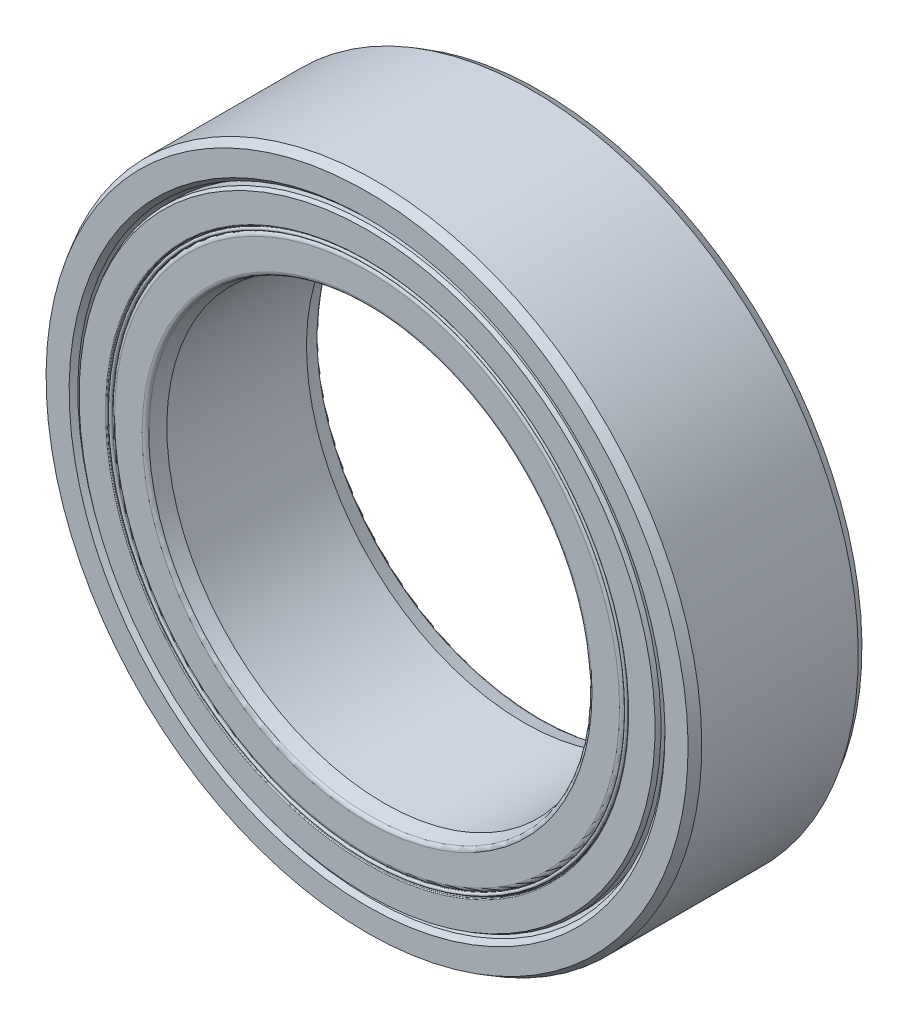
ISO-10303-21;
HEADER;
FILE_DESCRIPTION(('STEP AP214'),'2;1');
FILE_NAME('part.step','',(''),(''),'','','');
FILE_SCHEMA(('AUTOMOTIVE_DESIGN { 1 0 10303 214 1 1 1 1 }'));
ENDSEC;
DATA;
#1=APPLICATION_CONTEXT('core data for automotive mechanical design processes');
#2=APPLICATION_PROTOCOL_DEFINITION('international standard','automotive_design',2000,#1);
#3=PRODUCT_CONTEXT('',#1,'mechanical');
#4=PRODUCT('Part','Part','',(#3));
#5=PRODUCT_RELATED_PRODUCT_CATEGORY('part','',(#4));
#6=PRODUCT_DEFINITION_FORMATION('','',#4);
#7=PRODUCT_DEFINITION_CONTEXT('part definition',#1,'design');
#8=PRODUCT_DEFINITION('design','',#6,#7);
#9=PRODUCT_DEFINITION_SHAPE('','',#8);
#10=(LENGTH_UNIT() NAMED_UNIT(*) SI_UNIT(.MILLI.,.METRE.));
#11=(NAMED_UNIT(*) PLANE_ANGLE_UNIT() SI_UNIT($,.RADIAN.));
#12=(NAMED_UNIT(*) SI_UNIT($,.STERADIAN.) SOLID_ANGLE_UNIT());
#13=UNCERTAINTY_MEASURE_WITH_UNIT(LENGTH_MEASURE(1.E-05),#10,'distance_accuracy_value','');
#14=(GEOMETRIC_REPRESENTATION_CONTEXT(3) GLOBAL_UNCERTAINTY_ASSIGNED_CONTEXT((#13)) GLOBAL_UNIT_ASSIGNED_CONTEXT((#10,
#11,#12)) REPRESENTATION_CONTEXT('',''));
#15=CARTESIAN_POINT('',(0.,0.,0.));
#16=DIRECTION('',(0.,0.,1.));
#17=DIRECTION('',(1.,0.,0.));
#18=AXIS2_PLACEMENT_3D('',#15,#16,#17);
#19=CARTESIAN_POINT('',(0.,5.9,0.937499999999999));
#20=DIRECTION('',(0.,0.,1.));
#21=DIRECTION('',(0.,-1.,0.));
#22=AXIS2_PLACEMENT_3D('',#19,#20,#21);
#23=PLANE('',#22);
#24=CARTESIAN_POINT('',(0.,0.,0.937499999999998));
#25=DIRECTION('',(0.,0.,1.));
#26=DIRECTION('',(0.,-1.,0.));
#27=AXIS2_PLACEMENT_3D('',#24,#25,#26);
#28=CIRCLE('',#27,6.);
#29=CARTESIAN_POINT('',(0.,-6.,0.937499999999997));
#30=VERTEX_POINT('',#29);
#31=EDGE_CURVE('E11',#30,#30,#28,.T.);
#32=ORIENTED_EDGE('',*,*,#31,.F.);
#33=EDGE_LOOP('',(#32));
#34=FACE_BOUND('',#33,.T.);
#35=CARTESIAN_POINT('',(0.,0.,0.937499999999998));
#36=DIRECTION('',(0.,0.,1.));
#37=DIRECTION('',(0.,-1.,0.));
#38=AXIS2_PLACEMENT_3D('',#35,#36,#37);
#39=CIRCLE('',#38,5.9);
#40=CARTESIAN_POINT('',(0.,-5.9,0.937499999999997));
#41=VERTEX_POINT('',#40);
#42=EDGE_CURVE('E68',#41,#41,#39,.T.);
#43=ORIENTED_EDGE('',*,*,#42,.T.);
#44=EDGE_LOOP('',(#43));
#45=FACE_BOUND('',#44,.T.);
#46=ADVANCED_FACE('F43',(#34,#45),#23,.F.);
#47=CARTESIAN_POINT('',(0.,0.,2.));
#48=DIRECTION('',(0.,0.,1.));
#49=DIRECTION('',(0.,-1.,0.));
#50=AXIS2_PLACEMENT_3D('',#47,#48,#49);
#51=CYLINDRICAL_SURFACE('',#50,6.);
#52=CARTESIAN_POINT('',(0.,0.,1.91468721658815));
#53=DIRECTION('',(0.,0.,1.));
#54=DIRECTION('',(0.,-1.,0.));
#55=AXIS2_PLACEMENT_3D('',#52,#53,#54);
#56=CIRCLE('',#55,6.);
#57=CARTESIAN_POINT('',(0.,-6.,1.91468721658815));
#58=VERTEX_POINT('',#57);
#59=EDGE_CURVE('E49',#58,#58,#56,.T.);
#60=ORIENTED_EDGE('',*,*,#59,.F.);
#61=EDGE_LOOP('',(#60));
#62=FACE_BOUND('',#61,.T.);
#63=ORIENTED_EDGE('',*,*,#31,.T.);
#64=EDGE_LOOP('',(#63));
#65=FACE_BOUND('',#64,.T.);
#66=ADVANCED_FACE('F99',(#62,#65),#51,.T.);
#67=CARTESIAN_POINT('',(0.,0.,1.91468721658815));
#68=DIRECTION('',(0.,0.,-1.));
#69=DIRECTION('',(0.,1.,0.));
#70=AXIS2_PLACEMENT_3D('',#67,#68,#69);
#71=CONICAL_SURFACE('',#70,6.,0.174532925199406);
#72=CARTESIAN_POINT('',(0.,0.,1.93930741041345));
#73=DIRECTION('',(0.,0.,1.));
#74=DIRECTION('',(0.,-1.,0.));
#75=AXIS2_PLACEMENT_3D('',#72,#73,#74);
#76=CIRCLE('',#75,5.99565879555833);
#77=CARTESIAN_POINT('',(0.,-5.99565879555833,1.93930741041345));
#78=VERTEX_POINT('',#77);
#79=EDGE_CURVE('E53',#78,#78,#76,.T.);
#80=ORIENTED_EDGE('',*,*,#79,.F.);
#81=EDGE_LOOP('',(#80));
#82=FACE_BOUND('',#81,.T.);
#83=ORIENTED_EDGE('',*,*,#59,.T.);
#84=EDGE_LOOP('',(#83));
#85=FACE_BOUND('',#84,.T.);
#86=ADVANCED_FACE('F94',(#82,#85),#71,.T.);
#87=CARTESIAN_POINT('',(0.,0.,1.9375));
#88=DIRECTION('',(0.,0.,1.));
#89=DIRECTION('',(0.,-1.,0.));
#90=AXIS2_PLACEMENT_3D('',#87,#88,#89);
#91=TOROIDAL_SURFACE('',#90,5.98540846173992,0.0104084617399212);
#92=CARTESIAN_POINT('',(0.,0.,1.9375));
#93=DIRECTION('',(0.,0.,1.));
#94=DIRECTION('',(0.,-1.,0.));
#95=AXIS2_PLACEMENT_3D('',#92,#93,#94);
#96=CIRCLE('',#95,5.975);
#97=CARTESIAN_POINT('',(0.,-5.975,1.9375));
#98=VERTEX_POINT('',#97);
#99=EDGE_CURVE('E57',#98,#98,#96,.T.);
#100=ORIENTED_EDGE('',*,*,#99,.F.);
#101=EDGE_LOOP('',(#100));
#102=FACE_BOUND('',#101,.T.);
#103=ORIENTED_EDGE('',*,*,#79,.T.);
#104=EDGE_LOOP('',(#103));
#105=FACE_BOUND('',#104,.T.);
#106=ADVANCED_FACE('F88',(#102,#105),#91,.T.);
#107=CARTESIAN_POINT('',(0.,0.,2.));
#108=DIRECTION('',(0.,0.,1.));
#109=DIRECTION('',(0.,-1.,0.));
#110=AXIS2_PLACEMENT_3D('',#107,#108,#109);
#111=CYLINDRICAL_SURFACE('',#110,5.975);
#112=CARTESIAN_POINT('',(0.,0.,1.9625));
#113=DIRECTION('',(0.,0.,1.));
#114=DIRECTION('',(0.,-1.,0.));
#115=AXIS2_PLACEMENT_3D('',#112,#113,#114);
#116=CIRCLE('',#115,5.975);
#117=CARTESIAN_POINT('',(0.,-5.975,1.9625));
#118=VERTEX_POINT('',#117);
#119=EDGE_CURVE('E62',#118,#118,#116,.T.);
#120=ORIENTED_EDGE('',*,*,#119,.F.);
#121=EDGE_LOOP('',(#120));
#122=FACE_BOUND('',#121,.T.);
#123=ORIENTED_EDGE('',*,*,#99,.T.);
#124=EDGE_LOOP('',(#123));
#125=FACE_BOUND('',#124,.T.);
#126=ADVANCED_FACE('F82',(#122,#125),#111,.T.);
#127=CARTESIAN_POINT('',(0.,0.,1.9625));
#128=DIRECTION('',(0.,0.,1.));
#129=DIRECTION('',(0.,-1.,0.));
#130=AXIS2_PLACEMENT_3D('',#127,#128,#129);
#131=TOROIDAL_SURFACE('',#130,5.9375,0.0375000000000002);
#132=CARTESIAN_POINT('',(0.,0.,1.9625));
#133=DIRECTION('',(0.,0.,1.));
#134=DIRECTION('',(0.,-1.,0.));
#135=AXIS2_PLACEMENT_3D('',#132,#133,#134);
#136=CIRCLE('',#135,5.9);
#137=CARTESIAN_POINT('',(0.,-5.9,1.9625));
#138=VERTEX_POINT('',#137);
#139=EDGE_CURVE('E65',#138,#138,#136,.T.);
#140=ORIENTED_EDGE('',*,*,#139,.F.);
#141=EDGE_LOOP('',(#140));
#142=FACE_BOUND('',#141,.T.);
#143=ORIENTED_EDGE('',*,*,#119,.T.);
#144=EDGE_LOOP('',(#143));
#145=FACE_BOUND('',#144,.T.);
#146=ADVANCED_FACE('F76',(#142,#145),#131,.T.);
#147=CARTESIAN_POINT('',(0.,0.,2.));
#148=DIRECTION('',(0.,0.,1.));
#149=DIRECTION('',(0.,-1.,0.));
#150=AXIS2_PLACEMENT_3D('',#147,#148,#149);
#151=CYLINDRICAL_SURFACE('',#150,5.9);
#152=ORIENTED_EDGE('',*,*,#42,.F.);
#153=EDGE_LOOP('',(#152));
#154=FACE_BOUND('',#153,.T.);
#155=ORIENTED_EDGE('',*,*,#139,.T.);
#156=EDGE_LOOP('',(#155));
#157=FACE_BOUND('',#156,.T.);
#158=ADVANCED_FACE('F73',(#154,#157),#151,.F.);
#159=CLOSED_SHELL('',(#46,#66,#86,#106,#126,#146,#158));
#160=MANIFOLD_SOLID_BREP('B2',#159);
#161=CARTESIAN_POINT('',(0.,0.,-2.));
#162=DIRECTION('',(0.,0.,1.));
#163=DIRECTION('',(0.,-1.,0.));
#164=AXIS2_PLACEMENT_3D('',#161,#162,#163);
#165=CONICAL_SURFACE('',#164,6.625,0.523598775598299);
#166=CARTESIAN_POINT('',(0.,0.,-1.91339745962156));
#167=DIRECTION('',(0.,0.,1.));
#168=DIRECTION('',(0.,-1.,0.));
#169=AXIS2_PLACEMENT_3D('',#166,#167,#168);
#170=CIRCLE('',#169,6.675);
#171=CARTESIAN_POINT('',(0.,-6.675,-1.91339745962156));
#172=VERTEX_POINT('',#171);
#173=EDGE_CURVE('E179',#172,#172,#170,.T.);
#174=ORIENTED_EDGE('',*,*,#173,.F.);
#175=EDGE_LOOP('',(#174));
#176=FACE_BOUND('',#175,.T.);
#177=CARTESIAN_POINT('',(0.,0.,-2.));
#178=DIRECTION('',(0.,0.,1.));
#179=DIRECTION('',(0.,-1.,0.));
#180=AXIS2_PLACEMENT_3D('',#177,#178,#179);
#181=CIRCLE('',#180,6.625);
#182=CARTESIAN_POINT('',(0.,-6.625,-2.00000000000001));
#183=VERTEX_POINT('',#182);
#184=EDGE_CURVE('E42',#183,#183,#181,.T.);
#185=ORIENTED_EDGE('',*,*,#184,.T.);
#186=EDGE_LOOP('',(#185));
#187=FACE_BOUND('',#186,.T.);
#188=ADVANCED_FACE('F157',(#176,#187),#165,.T.);
#189=CARTESIAN_POINT('',(0.,6.625,-2.));
#190=DIRECTION('',(0.,0.,1.));
#191=DIRECTION('',(0.,-1.,0.));
#192=AXIS2_PLACEMENT_3D('',#189,#190,#191);
#193=PLANE('',#192);
#194=ORIENTED_EDGE('',*,*,#184,.F.);
#195=EDGE_LOOP('',(#194));
#196=FACE_BOUND('',#195,.T.);
#197=CARTESIAN_POINT('',(0.,0.,-2.));
#198=DIRECTION('',(0.,0.,1.));
#199=DIRECTION('',(0.,-1.,0.));
#200=AXIS2_PLACEMENT_3D('',#197,#198,#199);
#201=CIRCLE('',#200,6.02);
#202=CARTESIAN_POINT('',(0.,-6.02,-2.00000000000001));
#203=VERTEX_POINT('',#202);
#204=EDGE_CURVE('E163',#203,#203,#201,.T.);
#205=ORIENTED_EDGE('',*,*,#204,.T.);
#206=EDGE_LOOP('',(#205));
#207=FACE_BOUND('',#206,.T.);
#208=ADVANCED_FACE('F186',(#196,#207),#193,.F.);
#209=CARTESIAN_POINT('',(0.,0.,-1.98));
#210=DIRECTION('',(0.,0.,1.));
#211=DIRECTION('',(0.,-1.,0.));
#212=AXIS2_PLACEMENT_3D('',#209,#210,#211);
#213=TOROIDAL_SURFACE('',#212,6.02,0.0200000000000001);
#214=ORIENTED_EDGE('',*,*,#204,.F.);
#215=EDGE_LOOP('',(#214));
#216=FACE_BOUND('',#215,.T.);
#217=CARTESIAN_POINT('',(0.,0.,-1.98));
#218=DIRECTION('',(0.,0.,1.));
#219=DIRECTION('',(0.,-1.,0.));
#220=AXIS2_PLACEMENT_3D('',#217,#218,#219);
#221=CIRCLE('',#220,6.);
#222=CARTESIAN_POINT('',(0.,-6.,-1.98000000000001));
#223=VERTEX_POINT('',#222);
#224=EDGE_CURVE('E167',#223,#223,#221,.T.);
#225=ORIENTED_EDGE('',*,*,#224,.T.);
#226=EDGE_LOOP('',(#225));
#227=FACE_BOUND('',#226,.T.);
#228=ADVANCED_FACE('F190',(#216,#227),#213,.T.);
#229=CARTESIAN_POINT('',(0.,0.,2.));
#230=DIRECTION('',(0.,0.,1.));
#231=DIRECTION('',(0.,-1.,0.));
#232=AXIS2_PLACEMENT_3D('',#229,#230,#231);
#233=CYLINDRICAL_SURFACE('',#232,6.);
#234=ORIENTED_EDGE('',*,*,#224,.F.);
#235=EDGE_LOOP('',(#234));
#236=FACE_BOUND('',#235,.T.);
#237=CARTESIAN_POINT('',(0.,0.,-0.937500000000002));
#238=DIRECTION('',(0.,0.,1.));
#239=DIRECTION('',(0.,-1.,0.));
#240=AXIS2_PLACEMENT_3D('',#237,#238,#239);
#241=CIRCLE('',#240,6.);
#242=CARTESIAN_POINT('',(0.,-6.,-0.937500000000003));
#243=VERTEX_POINT('',#242);
#244=EDGE_CURVE('E171',#243,#243,#241,.T.);
#245=ORIENTED_EDGE('',*,*,#244,.T.);
#246=EDGE_LOOP('',(#245));
#247=FACE_BOUND('',#246,.T.);
#248=ADVANCED_FACE('F195',(#236,#247),#233,.F.);
#249=CARTESIAN_POINT('',(0.,6.675,-0.937500000000001));
#250=DIRECTION('',(0.,0.,-1.));
#251=DIRECTION('',(0.,1.,0.));
#252=AXIS2_PLACEMENT_3D('',#249,#250,#251);
#253=PLANE('',#252);
#254=ORIENTED_EDGE('',*,*,#244,.F.);
#255=EDGE_LOOP('',(#254));
#256=FACE_BOUND('',#255,.T.);
#257=CARTESIAN_POINT('',(0.,0.,-0.937500000000002));
#258=DIRECTION('',(0.,0.,1.));
#259=DIRECTION('',(0.,-1.,0.));
#260=AXIS2_PLACEMENT_3D('',#257,#258,#259);
#261=CIRCLE('',#260,6.675);
#262=CARTESIAN_POINT('',(0.,-6.675,-0.937500000000003));
#263=VERTEX_POINT('',#262);
#264=EDGE_CURVE('E176',#263,#263,#261,.T.);
#265=ORIENTED_EDGE('',*,*,#264,.T.);
#266=EDGE_LOOP('',(#265));
#267=FACE_BOUND('',#266,.T.);
#268=ADVANCED_FACE('F201',(#256,#267),#253,.F.);
#269=CARTESIAN_POINT('',(0.,0.,2.));
#270=DIRECTION('',(0.,0.,1.));
#271=DIRECTION('',(0.,-1.,0.));
#272=AXIS2_PLACEMENT_3D('',#269,#270,#271);
#273=CYLINDRICAL_SURFACE('',#272,6.675);
#274=ORIENTED_EDGE('',*,*,#264,.F.);
#275=EDGE_LOOP('',(#274));
#276=FACE_BOUND('',#275,.T.);
#277=ORIENTED_EDGE('',*,*,#173,.T.);
#278=EDGE_LOOP('',(#277));
#279=FACE_BOUND('',#278,.T.);
#280=ADVANCED_FACE('F183',(#276,#279),#273,.T.);
#281=CLOSED_SHELL('',(#188,#208,#228,#248,#268,#280));
#282=MANIFOLD_SOLID_BREP('B6',#281);
#283=CARTESIAN_POINT('',(0.,6.675,0.9375));
#284=DIRECTION('',(0.,0.,1.));
#285=DIRECTION('',(0.,-1.,0.));
#286=AXIS2_PLACEMENT_3D('',#283,#284,#285);
#287=PLANE('',#286);
#288=CARTESIAN_POINT('',(0.,0.,0.937499999999998));
#289=DIRECTION('',(0.,0.,1.));
#290=DIRECTION('',(0.,-1.,0.));
#291=AXIS2_PLACEMENT_3D('',#288,#289,#290);
#292=CIRCLE('',#291,6.675);
#293=CARTESIAN_POINT('',(0.,-6.675,0.937499999999997));
#294=VERTEX_POINT('',#293);
#295=EDGE_CURVE('E156',#294,#294,#292,.T.);
#296=ORIENTED_EDGE('',*,*,#295,.F.);
#297=EDGE_LOOP('',(#296));
#298=FACE_BOUND('',#297,.T.);
#299=CARTESIAN_POINT('',(0.,0.,0.937499999999998));
#300=DIRECTION('',(0.,0.,1.));
#301=DIRECTION('',(0.,-1.,0.));
#302=AXIS2_PLACEMENT_3D('',#299,#300,#301);
#303=CIRCLE('',#302,6.);
#304=CARTESIAN_POINT('',(0.,-6.,0.937499999999997));
#305=VERTEX_POINT('',#304);
#306=EDGE_CURVE('E276',#305,#305,#303,.T.);
#307=ORIENTED_EDGE('',*,*,#306,.T.);
#308=EDGE_LOOP('',(#307));
#309=FACE_BOUND('',#308,.T.);
#310=ADVANCED_FACE('F254',(#298,#309),#287,.F.);
#311=CARTESIAN_POINT('',(0.,0.,2.));
#312=DIRECTION('',(0.,0.,1.));
#313=DIRECTION('',(0.,-1.,0.));
#314=AXIS2_PLACEMENT_3D('',#311,#312,#313);
#315=CYLINDRICAL_SURFACE('',#314,6.675);
#316=CARTESIAN_POINT('',(0.,0.,1.91339745962156));
#317=DIRECTION('',(0.,0.,1.));
#318=DIRECTION('',(0.,-1.,0.));
#319=AXIS2_PLACEMENT_3D('',#316,#317,#318);
#320=CIRCLE('',#319,6.675);
#321=CARTESIAN_POINT('',(0.,-6.675,1.91339745962156));
#322=VERTEX_POINT('',#321);
#323=EDGE_CURVE('E260',#322,#322,#320,.T.);
#324=ORIENTED_EDGE('',*,*,#323,.F.);
#325=EDGE_LOOP('',(#324));
#326=FACE_BOUND('',#325,.T.);
#327=ORIENTED_EDGE('',*,*,#295,.T.);
#328=EDGE_LOOP('',(#327));
#329=FACE_BOUND('',#328,.T.);
#330=ADVANCED_FACE('F301',(#326,#329),#315,.T.);
#331=CARTESIAN_POINT('',(0.,0.,1.91339745962156));
#332=DIRECTION('',(0.,0.,-1.));
#333=DIRECTION('',(0.,1.,0.));
#334=AXIS2_PLACEMENT_3D('',#331,#332,#333);
#335=CONICAL_SURFACE('',#334,6.675,0.523598775598299);
#336=CARTESIAN_POINT('',(0.,0.,2.));
#337=DIRECTION('',(0.,0.,1.));
#338=DIRECTION('',(0.,-1.,0.));
#339=AXIS2_PLACEMENT_3D('',#336,#337,#338);
#340=CIRCLE('',#339,6.625);
#341=CARTESIAN_POINT('',(0.,-6.625,2.));
#342=VERTEX_POINT('',#341);
#343=EDGE_CURVE('E264',#342,#342,#340,.T.);
#344=ORIENTED_EDGE('',*,*,#343,.F.);
#345=EDGE_LOOP('',(#344));
#346=FACE_BOUND('',#345,.T.);
#347=ORIENTED_EDGE('',*,*,#323,.T.);
#348=EDGE_LOOP('',(#347));
#349=FACE_BOUND('',#348,.T.);
#350=ADVANCED_FACE('F296',(#346,#349),#335,.T.);
#351=CARTESIAN_POINT('',(0.,6.625,2.));
#352=DIRECTION('',(0.,0.,-1.));
#353=DIRECTION('',(0.,1.,0.));
#354=AXIS2_PLACEMENT_3D('',#351,#352,#353);
#355=PLANE('',#354);
#356=CARTESIAN_POINT('',(0.,0.,2.));
#357=DIRECTION('',(0.,0.,1.));
#358=DIRECTION('',(0.,-1.,0.));
#359=AXIS2_PLACEMENT_3D('',#356,#357,#358);
#360=CIRCLE('',#359,6.02);
#361=CARTESIAN_POINT('',(0.,-6.02,2.));
#362=VERTEX_POINT('',#361);
#363=EDGE_CURVE('E268',#362,#362,#360,.T.);
#364=ORIENTED_EDGE('',*,*,#363,.F.);
#365=EDGE_LOOP('',(#364));
#366=FACE_BOUND('',#365,.T.);
#367=ORIENTED_EDGE('',*,*,#343,.T.);
#368=EDGE_LOOP('',(#367));
#369=FACE_BOUND('',#368,.T.);
#370=ADVANCED_FACE('F290',(#366,#369),#355,.F.);
#371=CARTESIAN_POINT('',(0.,0.,1.98));
#372=DIRECTION('',(0.,0.,1.));
#373=DIRECTION('',(0.,-1.,0.));
#374=AXIS2_PLACEMENT_3D('',#371,#372,#373);
#375=TOROIDAL_SURFACE('',#374,6.02,0.0200000000000001);
#376=CARTESIAN_POINT('',(0.,0.,1.98));
#377=DIRECTION('',(0.,0.,1.));
#378=DIRECTION('',(0.,-1.,0.));
#379=AXIS2_PLACEMENT_3D('',#376,#377,#378);
#380=CIRCLE('',#379,6.);
#381=CARTESIAN_POINT('',(0.,-6.,1.98));
#382=VERTEX_POINT('',#381);
#383=EDGE_CURVE('E273',#382,#382,#380,.T.);
#384=ORIENTED_EDGE('',*,*,#383,.F.);
#385=EDGE_LOOP('',(#384));
#386=FACE_BOUND('',#385,.T.);
#387=ORIENTED_EDGE('',*,*,#363,.T.);
#388=EDGE_LOOP('',(#387));
#389=FACE_BOUND('',#388,.T.);
#390=ADVANCED_FACE('F284',(#386,#389),#375,.T.);
#391=CARTESIAN_POINT('',(0.,0.,2.));
#392=DIRECTION('',(0.,0.,1.));
#393=DIRECTION('',(0.,-1.,0.));
#394=AXIS2_PLACEMENT_3D('',#391,#392,#393);
#395=CYLINDRICAL_SURFACE('',#394,6.);
#396=ORIENTED_EDGE('',*,*,#306,.F.);
#397=EDGE_LOOP('',(#396));
#398=FACE_BOUND('',#397,.T.);
#399=ORIENTED_EDGE('',*,*,#383,.T.);
#400=EDGE_LOOP('',(#399));
#401=FACE_BOUND('',#400,.T.);
#402=ADVANCED_FACE('F281',(#398,#401),#395,.F.);
#403=CLOSED_SHELL('',(#310,#330,#350,#370,#390,#402));
#404=MANIFOLD_SOLID_BREP('B37',#403);
#405=CARTESIAN_POINT('',(-2.72804400970157,5.66484175693649,0.));
#406=DIRECTION('',(0.,0.,1.));
#407=DIRECTION('',(-0.433883739117546,0.900968867902425,0.));
#408=AXIS2_PLACEMENT_3D('',#405,#406,#407);
#409=SPHERICAL_SURFACE('',#408,0.937499999999999);
#410=CARTESIAN_POINT('',(-2.72804400970157,5.66484175693649,0.937499999999998));
#411=VERTEX_POINT('',#410);
#412=VERTEX_LOOP('',#411);
#413=FACE_BOUND('',#412,.T.);
#414=ADVANCED_FACE('F366',(#413),#409,.T.);
#415=CLOSED_SHELL('',(#414));
#416=MANIFOLD_SOLID_BREP('B151',#415);
#417=CARTESIAN_POINT('',(-4.91576544601769,3.92019212918685,0.));
#418=DIRECTION('',(0.,0.,1.));
#419=DIRECTION('',(-0.781831482468022,0.623489801858743,0.));
#420=AXIS2_PLACEMENT_3D('',#417,#418,#419);
#421=SPHERICAL_SURFACE('',#420,0.937499999999999);
#422=CARTESIAN_POINT('',(-4.91576544601769,3.92019212918685,0.937499999999998));
#423=VERTEX_POINT('',#422);
#424=VERTEX_LOOP('',#423);
#425=FACE_BOUND('',#424,.T.);
#426=ADVANCED_FACE('F384',(#425),#421,.T.);
#427=CLOSED_SHELL('',(#426));
#428=MANIFOLD_SOLID_BREP('B250',#427);
#429=CARTESIAN_POINT('',(-6.1298592478432,1.39910037225039,0.));
#430=DIRECTION('',(0.,0.,1.));
#431=DIRECTION('',(-0.974927912181821,0.222520933956325,0.));
#432=AXIS2_PLACEMENT_3D('',#429,#430,#431);
#433=SPHERICAL_SURFACE('',#432,0.937499999999999);
#434=CARTESIAN_POINT('',(-6.1298592478432,1.39910037225039,0.937499999999997));
#435=VERTEX_POINT('',#434);
#436=VERTEX_LOOP('',#435);
#437=FACE_BOUND('',#436,.T.);
#438=ADVANCED_FACE('F402',(#437),#433,.T.);
#439=CLOSED_SHELL('',(#438));
#440=MANIFOLD_SOLID_BREP('B362',#439);
#441=CARTESIAN_POINT('',(-6.12985924784323,-1.39910037225027,0.));
#442=DIRECTION('',(0.,0.,1.));
#443=DIRECTION('',(-0.974927912181826,-0.222520933956305,0.));
#444=AXIS2_PLACEMENT_3D('',#441,#442,#443);
#445=SPHERICAL_SURFACE('',#444,0.937499999999999);
#446=CARTESIAN_POINT('',(-6.12985924784323,-1.39910037225027,0.937499999999997));
#447=VERTEX_POINT('',#446);
#448=VERTEX_LOOP('',#447);
#449=FACE_BOUND('',#448,.T.);
#450=ADVANCED_FACE('F420',(#449),#445,.T.);
#451=CLOSED_SHELL('',(#450));
#452=MANIFOLD_SOLID_BREP('B380',#451);
#453=CARTESIAN_POINT('',(-4.91576544601777,-3.92019212918674,0.));
#454=DIRECTION('',(0.,0.,1.));
#455=DIRECTION('',(-0.781831482468035,-0.623489801858727,0.));
#456=AXIS2_PLACEMENT_3D('',#453,#454,#455);
#457=SPHERICAL_SURFACE('',#456,0.937499999999999);
#458=CARTESIAN_POINT('',(-4.91576544601777,-3.92019212918674,0.937499999999996));
#459=VERTEX_POINT('',#458);
#460=VERTEX_LOOP('',#459);
#461=FACE_BOUND('',#460,.T.);
#462=ADVANCED_FACE('F438',(#461),#457,.T.);
#463=CLOSED_SHELL('',(#462));
#464=MANIFOLD_SOLID_BREP('B398',#463);
#465=CARTESIAN_POINT('',(-2.72804400970169,-5.66484175693644,0.));
#466=DIRECTION('',(0.,0.,1.));
#467=DIRECTION('',(-0.433883739117565,-0.900968867902416,0.));
#468=AXIS2_PLACEMENT_3D('',#465,#466,#467);
#469=SPHERICAL_SURFACE('',#468,0.937499999999999);
#470=CARTESIAN_POINT('',(-2.72804400970169,-5.66484175693644,0.937499999999996));
#471=VERTEX_POINT('',#470);
#472=VERTEX_LOOP('',#471);
#473=FACE_BOUND('',#472,.T.);
#474=ADVANCED_FACE('F456',(#473),#469,.T.);
#475=CLOSED_SHELL('',(#474));
#476=MANIFOLD_SOLID_BREP('B416',#475);
#477=CARTESIAN_POINT('',(0.,-6.2875,0.));
#478=DIRECTION('',(0.,0.,1.));
#479=DIRECTION('',(0.,-1.,0.));
#480=AXIS2_PLACEMENT_3D('',#477,#478,#479);
#481=SPHERICAL_SURFACE('',#480,0.937499999999999);
#482=CARTESIAN_POINT('',(0.,-6.2875,0.937499999999996));
#483=VERTEX_POINT('',#482);
#484=VERTEX_LOOP('',#483);
#485=FACE_BOUND('',#484,.T.);
#486=ADVANCED_FACE('F474',(#485),#481,.T.);
#487=CLOSED_SHELL('',(#486));
#488=MANIFOLD_SOLID_BREP('B434',#487);
#489=CARTESIAN_POINT('',(2.72804400970161,-5.66484175693648,0.));
#490=DIRECTION('',(0.,0.,1.));
#491=DIRECTION('',(0.433883739117553,-0.900968867902422,0.));
#492=AXIS2_PLACEMENT_3D('',#489,#490,#491);
#493=SPHERICAL_SURFACE('',#492,0.937499999999999);
#494=CARTESIAN_POINT('',(2.72804400970161,-5.66484175693648,0.937499999999996));
#495=VERTEX_POINT('',#494);
#496=VERTEX_LOOP('',#495);
#497=FACE_BOUND('',#496,.T.);
#498=ADVANCED_FACE('F492',(#497),#493,.T.);
#499=CLOSED_SHELL('',(#498));
#500=MANIFOLD_SOLID_BREP('B452',#499);
#501=CARTESIAN_POINT('',(4.91576544601772,-3.92019212918681,0.));
#502=DIRECTION('',(0.,0.,1.));
#503=DIRECTION('',(0.781831482468027,-0.623489801858737,0.));
#504=AXIS2_PLACEMENT_3D('',#501,#502,#503);
#505=SPHERICAL_SURFACE('',#504,0.937499999999999);
#506=CARTESIAN_POINT('',(4.91576544601772,-3.92019212918681,0.937499999999996));
#507=VERTEX_POINT('',#506);
#508=VERTEX_LOOP('',#507);
#509=FACE_BOUND('',#508,.T.);
#510=ADVANCED_FACE('F510',(#509),#505,.T.);
#511=CLOSED_SHELL('',(#510));
#512=MANIFOLD_SOLID_BREP('B470',#511);
#513=CARTESIAN_POINT('',(6.12985924784321,-1.39910037225035,0.));
#514=DIRECTION('',(0.,0.,1.));
#515=DIRECTION('',(0.974927912181823,-0.222520933956318,0.));
#516=AXIS2_PLACEMENT_3D('',#513,#514,#515);
#517=SPHERICAL_SURFACE('',#516,0.937499999999999);
#518=CARTESIAN_POINT('',(6.12985924784321,-1.39910037225035,0.937499999999997));
#519=VERTEX_POINT('',#518);
#520=VERTEX_LOOP('',#519);
#521=FACE_BOUND('',#520,.T.);
#522=ADVANCED_FACE('F528',(#521),#517,.T.);
#523=CLOSED_SHELL('',(#522));
#524=MANIFOLD_SOLID_BREP('B488',#523);
#525=CARTESIAN_POINT('',(6.12985924784322,1.39910037225031,0.));
#526=DIRECTION('',(0.,0.,1.));
#527=DIRECTION('',(0.974927912181824,0.222520933956311,0.));
#528=AXIS2_PLACEMENT_3D('',#525,#526,#527);
#529=SPHERICAL_SURFACE('',#528,0.937499999999999);
#530=CARTESIAN_POINT('',(6.12985924784322,1.39910037225031,0.937499999999997));
#531=VERTEX_POINT('',#530);
#532=VERTEX_LOOP('',#531);
#533=FACE_BOUND('',#532,.T.);
#534=ADVANCED_FACE('F546',(#533),#529,.T.);
#535=CLOSED_SHELL('',(#534));
#536=MANIFOLD_SOLID_BREP('B506',#535);
#537=CARTESIAN_POINT('',(4.91576544601774,3.92019212918678,0.));
#538=DIRECTION('',(0.,0.,1.));
#539=DIRECTION('',(0.781831482468031,0.623489801858732,0.));
#540=AXIS2_PLACEMENT_3D('',#537,#538,#539);
#541=SPHERICAL_SURFACE('',#540,0.937499999999999);
#542=CARTESIAN_POINT('',(4.91576544601774,3.92019212918678,0.937499999999998));
#543=VERTEX_POINT('',#542);
#544=VERTEX_LOOP('',#543);
#545=FACE_BOUND('',#544,.T.);
#546=ADVANCED_FACE('F564',(#545),#541,.T.);
#547=CLOSED_SHELL('',(#546));
#548=MANIFOLD_SOLID_BREP('B524',#547);
#549=CARTESIAN_POINT('',(2.72804400970165,5.66484175693646,0.));
#550=DIRECTION('',(0.,0.,1.));
#551=DIRECTION('',(0.433883739117559,0.900968867902419,0.));
#552=AXIS2_PLACEMENT_3D('',#549,#550,#551);
#553=SPHERICAL_SURFACE('',#552,0.937499999999999);
#554=CARTESIAN_POINT('',(2.72804400970165,5.66484175693646,0.937499999999998));
#555=VERTEX_POINT('',#554);
#556=VERTEX_LOOP('',#555);
#557=FACE_BOUND('',#556,.T.);
#558=ADVANCED_FACE('F582',(#557),#553,.T.);
#559=CLOSED_SHELL('',(#558));
#560=MANIFOLD_SOLID_BREP('B542',#559);
#561=CARTESIAN_POINT('',(0.,6.2875,0.));
#562=DIRECTION('',(0.,0.,1.));
#563=DIRECTION('',(0.,1.,0.));
#564=AXIS2_PLACEMENT_3D('',#561,#562,#563);
#565=SPHERICAL_SURFACE('',#564,0.937499999999999);
#566=CARTESIAN_POINT('',(0.,6.2875,0.937499999999998));
#567=VERTEX_POINT('',#566);
#568=VERTEX_LOOP('',#567);
#569=FACE_BOUND('',#568,.T.);
#570=ADVANCED_FACE('F602',(#569),#565,.T.);
#571=CLOSED_SHELL('',(#570));
#572=MANIFOLD_SOLID_BREP('B560',#571);
#573=CARTESIAN_POINT('',(0.,0.,-1.90941333421412));
#574=DIRECTION('',(0.,0.,1.));
#575=DIRECTION('',(0.,-1.,0.));
#576=AXIS2_PLACEMENT_3D('',#573,#574,#575);
#577=TOROIDAL_SURFACE('',#576,5.175,0.0905866657858814);
#578=CARTESIAN_POINT('',(0.,0.,-2.));
#579=DIRECTION('',(0.,0.,1.));
#580=DIRECTION('',(0.,-1.,0.));
#581=AXIS2_PLACEMENT_3D('',#578,#579,#580);
#582=CIRCLE('',#581,5.175);
#583=CARTESIAN_POINT('',(0.,-5.175,-2.));
#584=VERTEX_POINT('',#583);
#585=EDGE_CURVE('E601',#584,#584,#582,.T.);
#586=ORIENTED_EDGE('',*,*,#585,.F.);
#587=EDGE_LOOP('',(#586));
#588=FACE_BOUND('',#587,.T.);
#589=CARTESIAN_POINT('',(0.,0.,-1.93285888855184));
#590=DIRECTION('',(0.,0.,1.));
#591=DIRECTION('',(0.,-1.,0.));
#592=AXIS2_PLACEMENT_3D('',#589,#590,#591);
#593=CIRCLE('',#592,5.0875);
#594=CARTESIAN_POINT('',(0.,-5.0875,-1.93285888855185));
#595=VERTEX_POINT('',#594);
#596=EDGE_CURVE('E661',#595,#595,#593,.T.);
#597=ORIENTED_EDGE('',*,*,#596,.T.);
#598=EDGE_LOOP('',(#597));
#599=FACE_BOUND('',#598,.T.);
#600=ADVANCED_FACE('F621',(#588,#599),#577,.T.);
#601=CARTESIAN_POINT('',(0.,5.175,-2.));
#602=DIRECTION('',(0.,0.,1.));
#603=DIRECTION('',(0.,-1.,0.));
#604=AXIS2_PLACEMENT_3D('',#601,#602,#603);
#605=PLANE('',#604);
#606=CARTESIAN_POINT('',(0.,0.,-2.));
#607=DIRECTION('',(0.,0.,1.));
#608=DIRECTION('',(0.,-1.,0.));
#609=AXIS2_PLACEMENT_3D('',#606,#607,#608);
#610=CIRCLE('',#609,5.80941333421412);
#611=CARTESIAN_POINT('',(0.,-5.80941333421412,-2.));
#612=VERTEX_POINT('',#611);
#613=EDGE_CURVE('E627',#612,#612,#610,.T.);
#614=ORIENTED_EDGE('',*,*,#613,.F.);
#615=EDGE_LOOP('',(#614));
#616=FACE_BOUND('',#615,.T.);
#617=ORIENTED_EDGE('',*,*,#585,.T.);
#618=EDGE_LOOP('',(#617));
#619=FACE_BOUND('',#618,.T.);
#620=ADVANCED_FACE('F722',(#616,#619),#605,.F.);
#621=CARTESIAN_POINT('',(0.,0.,-1.90941333421412));
#622=DIRECTION('',(0.,0.,1.));
#623=DIRECTION('',(0.,-1.,0.));
#624=AXIS2_PLACEMENT_3D('',#621,#622,#623);
#625=TOROIDAL_SURFACE('',#624,5.80941333421412,0.0905866657858812);
#626=CARTESIAN_POINT('',(0.,0.,-1.90941333421412));
#627=DIRECTION('',(0.,0.,1.));
#628=DIRECTION('',(0.,-1.,0.));
#629=AXIS2_PLACEMENT_3D('',#626,#627,#628);
#630=CIRCLE('',#629,5.9);
#631=CARTESIAN_POINT('',(0.,-5.9,-1.90941333421412));
#632=VERTEX_POINT('',#631);
#633=EDGE_CURVE('E631',#632,#632,#630,.T.);
#634=ORIENTED_EDGE('',*,*,#633,.F.);
#635=EDGE_LOOP('',(#634));
#636=FACE_BOUND('',#635,.T.);
#637=ORIENTED_EDGE('',*,*,#613,.T.);
#638=EDGE_LOOP('',(#637));
#639=FACE_BOUND('',#638,.T.);
#640=ADVANCED_FACE('F717',(#636,#639),#625,.T.);
#641=CARTESIAN_POINT('',(0.,0.,2.));
#642=DIRECTION('',(0.,0.,1.));
#643=DIRECTION('',(0.,-1.,0.));
#644=AXIS2_PLACEMENT_3D('',#641,#642,#643);
#645=CYLINDRICAL_SURFACE('',#644,5.9);
#646=CARTESIAN_POINT('',(0.,0.,-0.853668553948194));
#647=DIRECTION('',(0.,0.,1.));
#648=DIRECTION('',(0.,-1.,0.));
#649=AXIS2_PLACEMENT_3D('',#646,#647,#648);
#650=CIRCLE('',#649,5.9);
#651=CARTESIAN_POINT('',(0.,-5.9,-0.853668553948195));
#652=VERTEX_POINT('',#651);
#653=EDGE_CURVE('E635',#652,#652,#650,.T.);
#654=ORIENTED_EDGE('',*,*,#653,.F.);
#655=EDGE_LOOP('',(#654));
#656=FACE_BOUND('',#655,.T.);
#657=ORIENTED_EDGE('',*,*,#633,.T.);
#658=EDGE_LOOP('',(#657));
#659=FACE_BOUND('',#658,.T.);
#660=ADVANCED_FACE('F711',(#656,#659),#645,.T.);
#661=CARTESIAN_POINT('',(0.,0.,0.));
#662=DIRECTION('',(0.,0.,1.));
#663=DIRECTION('',(0.,-1.,0.));
#664=AXIS2_PLACEMENT_3D('',#661,#662,#663);
#665=TOROIDAL_SURFACE('',#664,6.2875,0.9375);
#666=CARTESIAN_POINT('',(0.,0.,0.853668553948192));
#667=DIRECTION('',(0.,0.,1.));
#668=DIRECTION('',(0.,-1.,0.));
#669=AXIS2_PLACEMENT_3D('',#666,#667,#668);
#670=CIRCLE('',#669,5.9);
#671=CARTESIAN_POINT('',(0.,-5.9,0.853668553948191));
#672=VERTEX_POINT('',#671);
#673=EDGE_CURVE('E640',#672,#672,#670,.T.);
#674=ORIENTED_EDGE('',*,*,#673,.F.);
#675=EDGE_LOOP('',(#674));
#676=FACE_BOUND('',#675,.T.);
#677=ORIENTED_EDGE('',*,*,#653,.T.);
#678=EDGE_LOOP('',(#677));
#679=FACE_BOUND('',#678,.T.);
#680=ADVANCED_FACE('F705',(#676,#679),#665,.F.);
#681=CARTESIAN_POINT('',(0.,0.,2.));
#682=DIRECTION('',(0.,0.,1.));
#683=DIRECTION('',(0.,-1.,0.));
#684=AXIS2_PLACEMENT_3D('',#681,#682,#683);
#685=CYLINDRICAL_SURFACE('',#684,5.9);
#686=CARTESIAN_POINT('',(0.,0.,1.90941333421412));
#687=DIRECTION('',(0.,0.,1.));
#688=DIRECTION('',(0.,-1.,0.));
#689=AXIS2_PLACEMENT_3D('',#686,#687,#688);
#690=CIRCLE('',#689,5.9);
#691=CARTESIAN_POINT('',(0.,-5.9,1.90941333421412));
#692=VERTEX_POINT('',#691);
#693=EDGE_CURVE('E643',#692,#692,#690,.T.);
#694=ORIENTED_EDGE('',*,*,#693,.F.);
#695=EDGE_LOOP('',(#694));
#696=FACE_BOUND('',#695,.T.);
#697=ORIENTED_EDGE('',*,*,#673,.T.);
#698=EDGE_LOOP('',(#697));
#699=FACE_BOUND('',#698,.T.);
#700=ADVANCED_FACE('F699',(#696,#699),#685,.T.);
#701=CARTESIAN_POINT('',(0.,0.,1.90941333421412));
#702=DIRECTION('',(0.,0.,1.));
#703=DIRECTION('',(0.,-1.,0.));
#704=AXIS2_PLACEMENT_3D('',#701,#702,#703);
#705=TOROIDAL_SURFACE('',#704,5.80941333421412,0.0905866657858812);
#706=CARTESIAN_POINT('',(0.,0.,2.));
#707=DIRECTION('',(0.,0.,1.));
#708=DIRECTION('',(0.,-1.,0.));
#709=AXIS2_PLACEMENT_3D('',#706,#707,#708);
#710=CIRCLE('',#709,5.80941333421412);
#711=CARTESIAN_POINT('',(0.,-5.80941333421412,2.));
#712=VERTEX_POINT('',#711);
#713=EDGE_CURVE('E646',#712,#712,#710,.T.);
#714=ORIENTED_EDGE('',*,*,#713,.F.);
#715=EDGE_LOOP('',(#714));
#716=FACE_BOUND('',#715,.T.);
#717=ORIENTED_EDGE('',*,*,#693,.T.);
#718=EDGE_LOOP('',(#717));
#719=FACE_BOUND('',#718,.T.);
#720=ADVANCED_FACE('F693',(#716,#719),#705,.T.);
#721=CARTESIAN_POINT('',(0.,5.175,2.));
#722=DIRECTION('',(0.,0.,-1.));
#723=DIRECTION('',(0.,1.,0.));
#724=AXIS2_PLACEMENT_3D('',#721,#722,#723);
#725=PLANE('',#724);
#726=CARTESIAN_POINT('',(0.,0.,2.));
#727=DIRECTION('',(0.,0.,1.));
#728=DIRECTION('',(0.,-1.,0.));
#729=AXIS2_PLACEMENT_3D('',#726,#727,#728);
#730=CIRCLE('',#729,5.175);
#731=CARTESIAN_POINT('',(0.,-5.175,2.));
#732=VERTEX_POINT('',#731);
#733=EDGE_CURVE('E649',#732,#732,#730,.T.);
#734=ORIENTED_EDGE('',*,*,#733,.F.);
#735=EDGE_LOOP('',(#734));
#736=FACE_BOUND('',#735,.T.);
#737=ORIENTED_EDGE('',*,*,#713,.T.);
#738=EDGE_LOOP('',(#737));
#739=FACE_BOUND('',#738,.T.);
#740=ADVANCED_FACE('F687',(#736,#739),#725,.F.);
#741=CARTESIAN_POINT('',(0.,0.,1.90941333421412));
#742=DIRECTION('',(0.,0.,1.));
#743=DIRECTION('',(0.,-1.,0.));
#744=AXIS2_PLACEMENT_3D('',#741,#742,#743);
#745=TOROIDAL_SURFACE('',#744,5.175,0.0905866657858814);
#746=CARTESIAN_POINT('',(0.,0.,1.93285888855184));
#747=DIRECTION('',(0.,0.,1.));
#748=DIRECTION('',(0.,-1.,0.));
#749=AXIS2_PLACEMENT_3D('',#746,#747,#748);
#750=CIRCLE('',#749,5.0875);
#751=CARTESIAN_POINT('',(0.,-5.0875,1.93285888855184));
#752=VERTEX_POINT('',#751);
#753=EDGE_CURVE('E652',#752,#752,#750,.T.);
#754=ORIENTED_EDGE('',*,*,#753,.F.);
#755=EDGE_LOOP('',(#754));
#756=FACE_BOUND('',#755,.T.);
#757=ORIENTED_EDGE('',*,*,#733,.T.);
#758=EDGE_LOOP('',(#757));
#759=FACE_BOUND('',#758,.T.);
#760=ADVANCED_FACE('F681',(#756,#759),#745,.T.);
#761=CARTESIAN_POINT('',(0.,0.,1.93285888855184));
#762=DIRECTION('',(0.,0.,1.));
#763=DIRECTION('',(0.,-1.,0.));
#764=AXIS2_PLACEMENT_3D('',#761,#762,#763);
#765=CONICAL_SURFACE('',#764,5.0875,0.261799387799154);
#766=CARTESIAN_POINT('',(0.,0.,1.60630444288957));
#767=DIRECTION('',(0.,0.,1.));
#768=DIRECTION('',(0.,-1.,0.));
#769=AXIS2_PLACEMENT_3D('',#766,#767,#768);
#770=CIRCLE('',#769,5.);
#771=CARTESIAN_POINT('',(0.,-5.,1.60630444288957));
#772=VERTEX_POINT('',#771);
#773=EDGE_CURVE('E655',#772,#772,#770,.T.);
#774=ORIENTED_EDGE('',*,*,#773,.F.);
#775=EDGE_LOOP('',(#774));
#776=FACE_BOUND('',#775,.T.);
#777=ORIENTED_EDGE('',*,*,#753,.T.);
#778=EDGE_LOOP('',(#777));
#779=FACE_BOUND('',#778,.T.);
#780=ADVANCED_FACE('F675',(#776,#779),#765,.F.);
#781=CARTESIAN_POINT('',(0.,0.,2.));
#782=DIRECTION('',(0.,0.,1.));
#783=DIRECTION('',(0.,-1.,0.));
#784=AXIS2_PLACEMENT_3D('',#781,#782,#783);
#785=CYLINDRICAL_SURFACE('',#784,5.);
#786=CARTESIAN_POINT('',(0.,0.,-1.60630444288957));
#787=DIRECTION('',(0.,0.,1.));
#788=DIRECTION('',(0.,-1.,0.));
#789=AXIS2_PLACEMENT_3D('',#786,#787,#788);
#790=CIRCLE('',#789,5.);
#791=CARTESIAN_POINT('',(0.,-5.,-1.60630444288957));
#792=VERTEX_POINT('',#791);
#793=EDGE_CURVE('E658',#792,#792,#790,.T.);
#794=ORIENTED_EDGE('',*,*,#793,.F.);
#795=EDGE_LOOP('',(#794));
#796=FACE_BOUND('',#795,.T.);
#797=ORIENTED_EDGE('',*,*,#773,.T.);
#798=EDGE_LOOP('',(#797));
#799=FACE_BOUND('',#798,.T.);
#800=ADVANCED_FACE('F669',(#796,#799),#785,.F.);
#801=CARTESIAN_POINT('',(0.,0.,-1.60630444288957));
#802=DIRECTION('',(0.,0.,-1.));
#803=DIRECTION('',(0.,1.,0.));
#804=AXIS2_PLACEMENT_3D('',#801,#802,#803);
#805=CONICAL_SURFACE('',#804,5.,0.261799387799154);
#806=ORIENTED_EDGE('',*,*,#596,.F.);
#807=EDGE_LOOP('',(#806));
#808=FACE_BOUND('',#807,.T.);
#809=ORIENTED_EDGE('',*,*,#793,.T.);
#810=EDGE_LOOP('',(#809));
#811=FACE_BOUND('',#810,.T.);
#812=ADVANCED_FACE('F666',(#808,#811),#805,.F.);
#813=CLOSED_SHELL('',(#600,#620,#640,#660,#680,#700,#720,#740,#760,#780,#800,#812));
#814=MANIFOLD_SOLID_BREP('B578',#813);
#815=CARTESIAN_POINT('',(0.,0.,2.));
#816=DIRECTION('',(0.,0.,1.));
#817=DIRECTION('',(0.,-1.,0.));
#818=AXIS2_PLACEMENT_3D('',#815,#816,#817);
#819=CYLINDRICAL_SURFACE('',#818,6.675);
#820=CARTESIAN_POINT('',(0.,0.,0.85366855394819));
#821=DIRECTION('',(0.,0.,1.));
#822=DIRECTION('',(0.,-1.,0.));
#823=AXIS2_PLACEMENT_3D('',#820,#821,#822);
#824=CIRCLE('',#823,6.675);
#825=CARTESIAN_POINT('',(0.,-6.675,0.853668553948189));
#826=VERTEX_POINT('',#825);
#827=EDGE_CURVE('E620',#826,#826,#824,.T.);
#828=ORIENTED_EDGE('',*,*,#827,.F.);
#829=EDGE_LOOP('',(#828));
#830=FACE_BOUND('',#829,.T.);
#831=CARTESIAN_POINT('',(0.,0.,1.6829872849735));
#832=DIRECTION('',(0.,0.,1.));
#833=DIRECTION('',(0.,-1.,0.));
#834=AXIS2_PLACEMENT_3D('',#831,#832,#833);
#835=CIRCLE('',#834,6.675);
#836=CARTESIAN_POINT('',(0.,-6.675,1.6829872849735));
#837=VERTEX_POINT('',#836);
#838=EDGE_CURVE('E842',#837,#837,#835,.T.);
#839=ORIENTED_EDGE('',*,*,#838,.T.);
#840=EDGE_LOOP('',(#839));
#841=FACE_BOUND('',#840,.T.);
#842=ADVANCED_FACE('F802',(#830,#841),#819,.F.);
#843=CARTESIAN_POINT('',(0.,0.,0.));
#844=DIRECTION('',(0.,0.,1.));
#845=DIRECTION('',(0.,-1.,0.));
#846=AXIS2_PLACEMENT_3D('',#843,#844,#845);
#847=TOROIDAL_SURFACE('',#846,6.2875,0.937499999999999);
#848=CARTESIAN_POINT('',(0.,0.,-0.853668553948194));
#849=DIRECTION('',(0.,0.,1.));
#850=DIRECTION('',(0.,-1.,0.));
#851=AXIS2_PLACEMENT_3D('',#848,#849,#850);
#852=CIRCLE('',#851,6.675);
#853=CARTESIAN_POINT('',(0.,-6.675,-0.853668553948195));
#854=VERTEX_POINT('',#853);
#855=EDGE_CURVE('E808',#854,#854,#852,.T.);
#856=ORIENTED_EDGE('',*,*,#855,.F.);
#857=EDGE_LOOP('',(#856));
#858=FACE_BOUND('',#857,.T.);
#859=ORIENTED_EDGE('',*,*,#827,.T.);
#860=EDGE_LOOP('',(#859));
#861=FACE_BOUND('',#860,.T.);
#862=ADVANCED_FACE('F903',(#858,#861),#847,.F.);
#863=CARTESIAN_POINT('',(0.,0.,2.));
#864=DIRECTION('',(0.,0.,1.));
#865=DIRECTION('',(0.,-1.,0.));
#866=AXIS2_PLACEMENT_3D('',#863,#864,#865);
#867=CYLINDRICAL_SURFACE('',#866,6.675);
#868=CARTESIAN_POINT('',(0.,0.,-1.68298728497351));
#869=DIRECTION('',(0.,0.,1.));
#870=DIRECTION('',(0.,-1.,0.));
#871=AXIS2_PLACEMENT_3D('',#868,#869,#870);
#872=CIRCLE('',#871,6.675);
#873=CARTESIAN_POINT('',(0.,-6.675,-1.68298728497351));
#874=VERTEX_POINT('',#873);
#875=EDGE_CURVE('E812',#874,#874,#872,.T.);
#876=ORIENTED_EDGE('',*,*,#875,.F.);
#877=EDGE_LOOP('',(#876));
#878=FACE_BOUND('',#877,.T.);
#879=ORIENTED_EDGE('',*,*,#855,.T.);
#880=EDGE_LOOP('',(#879));
#881=FACE_BOUND('',#880,.T.);
#882=ADVANCED_FACE('F898',(#878,#881),#867,.F.);
#883=CARTESIAN_POINT('',(0.,0.,-1.68298728497351));
#884=DIRECTION('',(0.,0.,-1.));
#885=DIRECTION('',(0.,1.,0.));
#886=AXIS2_PLACEMENT_3D('',#883,#884,#885);
#887=CONICAL_SURFACE('',#886,6.675,0.349065850398861);
#888=CARTESIAN_POINT('',(0.,0.,-1.9));
#889=DIRECTION('',(0.,0.,1.));
#890=DIRECTION('',(0.,-1.,0.));
#891=AXIS2_PLACEMENT_3D('',#888,#889,#890);
#892=CIRCLE('',#891,6.75398616872694);
#893=CARTESIAN_POINT('',(0.,-6.75398616872694,-1.90000000000001));
#894=VERTEX_POINT('',#893);
#895=EDGE_CURVE('E816',#894,#894,#892,.T.);
#896=ORIENTED_EDGE('',*,*,#895,.F.);
#897=EDGE_LOOP('',(#896));
#898=FACE_BOUND('',#897,.T.);
#899=ORIENTED_EDGE('',*,*,#875,.T.);
#900=EDGE_LOOP('',(#899));
#901=FACE_BOUND('',#900,.T.);
#902=ADVANCED_FACE('F892',(#898,#901),#887,.F.);
#903=CARTESIAN_POINT('',(0.,0.,-1.9));
#904=DIRECTION('',(0.,0.,-1.));
#905=DIRECTION('',(0.,1.,0.));
#906=AXIS2_PLACEMENT_3D('',#903,#904,#905);
#907=CONICAL_SURFACE('',#906,6.75398616872694,0.785398163397455);
#908=CARTESIAN_POINT('',(0.,0.,-2.));
#909=DIRECTION('',(0.,0.,1.));
#910=DIRECTION('',(0.,-1.,0.));
#911=AXIS2_PLACEMENT_3D('',#908,#909,#910);
#912=CIRCLE('',#911,6.85398616872694);
#913=CARTESIAN_POINT('',(0.,-6.85398616872694,-2.));
#914=VERTEX_POINT('',#913);
#915=EDGE_CURVE('E821',#914,#914,#912,.T.);
#916=ORIENTED_EDGE('',*,*,#915,.F.);
#917=EDGE_LOOP('',(#916));
#918=FACE_BOUND('',#917,.T.);
#919=ORIENTED_EDGE('',*,*,#895,.T.);
#920=EDGE_LOOP('',(#919));
#921=FACE_BOUND('',#920,.T.);
#922=ADVANCED_FACE('F886',(#918,#921),#907,.F.);
#923=CARTESIAN_POINT('',(0.,7.38452994616208,-2.));
#924=DIRECTION('',(0.,0.,1.));
#925=DIRECTION('',(0.,-1.,0.));
#926=AXIS2_PLACEMENT_3D('',#923,#924,#925);
#927=PLANE('',#926);
#928=CARTESIAN_POINT('',(0.,0.,-2.));
#929=DIRECTION('',(0.,0.,1.));
#930=DIRECTION('',(0.,-1.,0.));
#931=AXIS2_PLACEMENT_3D('',#928,#929,#930);
#932=CIRCLE('',#931,7.38452994616208);
#933=CARTESIAN_POINT('',(0.,-7.38452994616207,-2.));
#934=VERTEX_POINT('',#933);
#935=EDGE_CURVE('E824',#934,#934,#932,.T.);
#936=ORIENTED_EDGE('',*,*,#935,.F.);
#937=EDGE_LOOP('',(#936));
#938=FACE_BOUND('',#937,.T.);
#939=ORIENTED_EDGE('',*,*,#915,.T.);
#940=EDGE_LOOP('',(#939));
#941=FACE_BOUND('',#940,.T.);
#942=ADVANCED_FACE('F880',(#938,#941),#927,.F.);
#943=CARTESIAN_POINT('',(0.,0.,-2.));
#944=DIRECTION('',(0.,0.,1.));
#945=DIRECTION('',(0.,-1.,0.));
#946=AXIS2_PLACEMENT_3D('',#943,#944,#945);
#947=CONICAL_SURFACE('',#946,7.38452994616208,0.523598775598291);
#948=CARTESIAN_POINT('',(0.,0.,-1.8));
#949=DIRECTION('',(0.,0.,1.));
#950=DIRECTION('',(0.,-1.,0.));
#951=AXIS2_PLACEMENT_3D('',#948,#949,#950);
#952=CIRCLE('',#951,7.5);
#953=CARTESIAN_POINT('',(0.,-7.5,-1.8));
#954=VERTEX_POINT('',#953);
#955=EDGE_CURVE('E827',#954,#954,#952,.T.);
#956=ORIENTED_EDGE('',*,*,#955,.F.);
#957=EDGE_LOOP('',(#956));
#958=FACE_BOUND('',#957,.T.);
#959=ORIENTED_EDGE('',*,*,#935,.T.);
#960=EDGE_LOOP('',(#959));
#961=FACE_BOUND('',#960,.T.);
#962=ADVANCED_FACE('F874',(#958,#961),#947,.T.);
#963=CARTESIAN_POINT('',(0.,0.,2.));
#964=DIRECTION('',(0.,0.,1.));
#965=DIRECTION('',(0.,-1.,0.));
#966=AXIS2_PLACEMENT_3D('',#963,#964,#965);
#967=CYLINDRICAL_SURFACE('',#966,7.5);
#968=CARTESIAN_POINT('',(0.,0.,1.8));
#969=DIRECTION('',(0.,0.,1.));
#970=DIRECTION('',(0.,-1.,0.));
#971=AXIS2_PLACEMENT_3D('',#968,#969,#970);
#972=CIRCLE('',#971,7.5);
#973=CARTESIAN_POINT('',(0.,-7.5,1.8));
#974=VERTEX_POINT('',#973);
#975=EDGE_CURVE('E830',#974,#974,#972,.T.);
#976=ORIENTED_EDGE('',*,*,#975,.F.);
#977=EDGE_LOOP('',(#976));
#978=FACE_BOUND('',#977,.T.);
#979=ORIENTED_EDGE('',*,*,#955,.T.);
#980=EDGE_LOOP('',(#979));
#981=FACE_BOUND('',#980,.T.);
#982=ADVANCED_FACE('F868',(#978,#981),#967,.T.);
#983=CARTESIAN_POINT('',(0.,0.,1.8));
#984=DIRECTION('',(0.,0.,-1.));
#985=DIRECTION('',(0.,1.,0.));
#986=AXIS2_PLACEMENT_3D('',#983,#984,#985);
#987=CONICAL_SURFACE('',#986,7.5,0.523598775598291);
#988=CARTESIAN_POINT('',(0.,0.,2.));
#989=DIRECTION('',(0.,0.,1.));
#990=DIRECTION('',(0.,-1.,0.));
#991=AXIS2_PLACEMENT_3D('',#988,#989,#990);
#992=CIRCLE('',#991,7.38452994616208);
#993=CARTESIAN_POINT('',(0.,-7.38452994616208,2.));
#994=VERTEX_POINT('',#993);
#995=EDGE_CURVE('E833',#994,#994,#992,.T.);
#996=ORIENTED_EDGE('',*,*,#995,.F.);
#997=EDGE_LOOP('',(#996));
#998=FACE_BOUND('',#997,.T.);
#999=ORIENTED_EDGE('',*,*,#975,.T.);
#1000=EDGE_LOOP('',(#999));
#1001=FACE_BOUND('',#1000,.T.);
#1002=ADVANCED_FACE('F862',(#998,#1001),#987,.T.);
#1003=CARTESIAN_POINT('',(0.,7.38452994616208,2.));
#1004=DIRECTION('',(0.,0.,-1.));
#1005=DIRECTION('',(0.,1.,0.));
#1006=AXIS2_PLACEMENT_3D('',#1003,#1004,#1005);
#1007=PLANE('',#1006);
#1008=CARTESIAN_POINT('',(0.,0.,2.));
#1009=DIRECTION('',(0.,0.,1.));
#1010=DIRECTION('',(0.,-1.,0.));
#1011=AXIS2_PLACEMENT_3D('',#1008,#1009,#1010);
#1012=CIRCLE('',#1011,6.85398616872694);
#1013=CARTESIAN_POINT('',(0.,-6.85398616872694,2.));
#1014=VERTEX_POINT('',#1013);
#1015=EDGE_CURVE('E836',#1014,#1014,#1012,.T.);
#1016=ORIENTED_EDGE('',*,*,#1015,.F.);
#1017=EDGE_LOOP('',(#1016));
#1018=FACE_BOUND('',#1017,.T.);
#1019=ORIENTED_EDGE('',*,*,#995,.T.);
#1020=EDGE_LOOP('',(#1019));
#1021=FACE_BOUND('',#1020,.T.);
#1022=ADVANCED_FACE('F856',(#1018,#1021),#1007,.F.);
#1023=CARTESIAN_POINT('',(0.,0.,2.));
#1024=DIRECTION('',(0.,0.,1.));
#1025=DIRECTION('',(0.,-1.,0.));
#1026=AXIS2_PLACEMENT_3D('',#1023,#1024,#1025);
#1027=CONICAL_SURFACE('',#1026,6.85398616872694,0.785398163397447);
#1028=CARTESIAN_POINT('',(0.,0.,1.9));
#1029=DIRECTION('',(0.,0.,1.));
#1030=DIRECTION('',(0.,-1.,0.));
#1031=AXIS2_PLACEMENT_3D('',#1028,#1029,#1030);
#1032=CIRCLE('',#1031,6.75398616872694);
#1033=CARTESIAN_POINT('',(0.,-6.75398616872694,1.9));
#1034=VERTEX_POINT('',#1033);
#1035=EDGE_CURVE('E839',#1034,#1034,#1032,.T.);
#1036=ORIENTED_EDGE('',*,*,#1035,.F.);
#1037=EDGE_LOOP('',(#1036));
#1038=FACE_BOUND('',#1037,.T.);
#1039=ORIENTED_EDGE('',*,*,#1015,.T.);
#1040=EDGE_LOOP('',(#1039));
#1041=FACE_BOUND('',#1040,.T.);
#1042=ADVANCED_FACE('F850',(#1038,#1041),#1027,.F.);
#1043=CARTESIAN_POINT('',(0.,0.,1.9));
#1044=DIRECTION('',(0.,0.,1.));
#1045=DIRECTION('',(0.,-1.,0.));
#1046=AXIS2_PLACEMENT_3D('',#1043,#1044,#1045);
#1047=CONICAL_SURFACE('',#1046,6.75398616872694,0.349065850398858);
#1048=ORIENTED_EDGE('',*,*,#838,.F.);
#1049=EDGE_LOOP('',(#1048));
#1050=FACE_BOUND('',#1049,.T.);
#1051=ORIENTED_EDGE('',*,*,#1035,.T.);
#1052=EDGE_LOOP('',(#1051));
#1053=FACE_BOUND('',#1052,.T.);
#1054=ADVANCED_FACE('F847',(#1050,#1053),#1047,.F.);
#1055=CLOSED_SHELL('',(#842,#862,#882,#902,#922,#942,#962,#982,#1002,#1022,#1042,#1054));
#1056=MANIFOLD_SOLID_BREP('B596',#1055);
#1057=ADVANCED_BREP_SHAPE_REPRESENTATION('',(#18,#160,#282,#404,#416,#428,#440,#452,#464,#476,
#488,#500,#512,#524,#536,#548,#560,#572,#814,#1056),#14);
#1058=SHAPE_DEFINITION_REPRESENTATION(#9,#1057);
ENDSEC;
END-ISO-10303-21;
